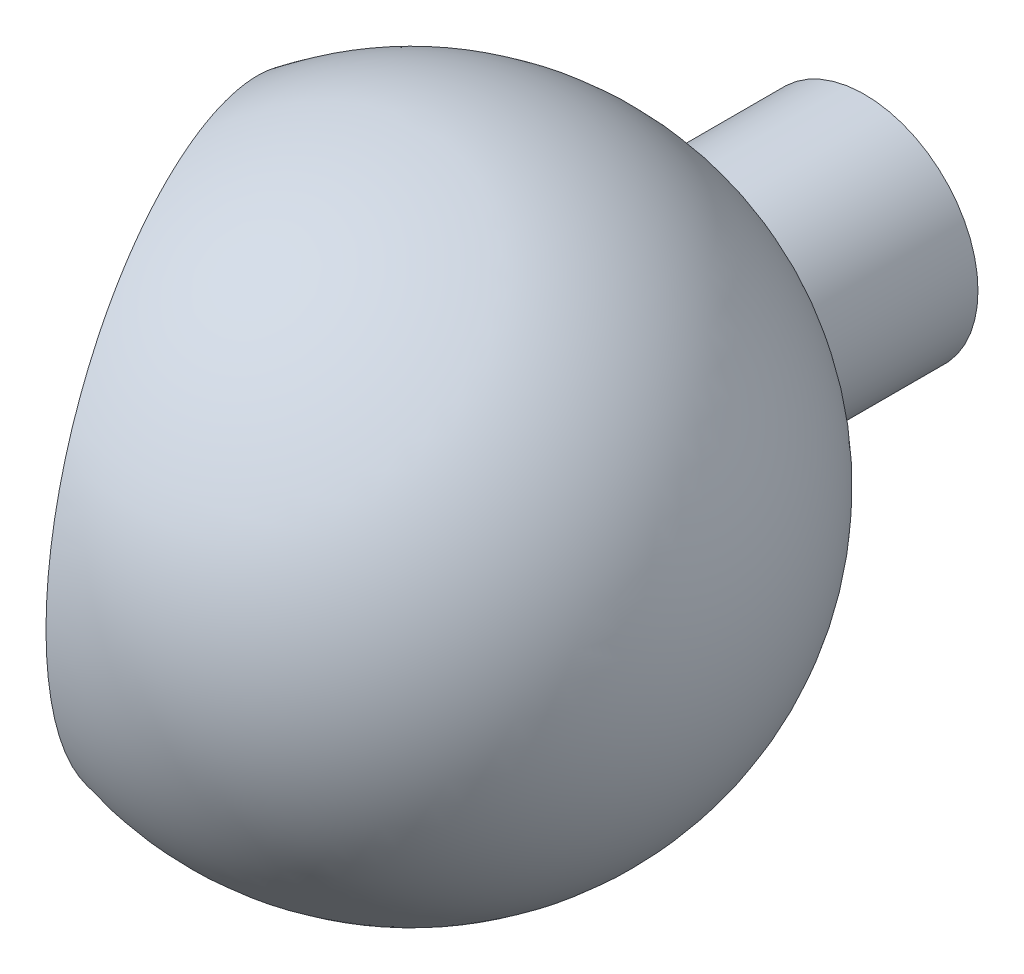
ISO-10303-21;
HEADER;
FILE_DESCRIPTION(('STEP AP214'),'2;1');
FILE_NAME('part.step','',(''),(''),'','','');
FILE_SCHEMA(('AUTOMOTIVE_DESIGN { 1 0 10303 214 1 1 1 1 }'));
ENDSEC;
DATA;
#1=APPLICATION_CONTEXT('core data for automotive mechanical design processes');
#2=APPLICATION_PROTOCOL_DEFINITION('international standard','automotive_design',2000,#1);
#3=PRODUCT_CONTEXT('',#1,'mechanical');
#4=PRODUCT('Part','Part','',(#3));
#5=PRODUCT_RELATED_PRODUCT_CATEGORY('part','',(#4));
#6=PRODUCT_DEFINITION_FORMATION('','',#4);
#7=PRODUCT_DEFINITION_CONTEXT('part definition',#1,'design');
#8=PRODUCT_DEFINITION('design','',#6,#7);
#9=PRODUCT_DEFINITION_SHAPE('','',#8);
#10=(LENGTH_UNIT() NAMED_UNIT(*) SI_UNIT(.MILLI.,.METRE.));
#11=(NAMED_UNIT(*) PLANE_ANGLE_UNIT() SI_UNIT($,.RADIAN.));
#12=(NAMED_UNIT(*) SI_UNIT($,.STERADIAN.) SOLID_ANGLE_UNIT());
#13=UNCERTAINTY_MEASURE_WITH_UNIT(LENGTH_MEASURE(1.E-05),#10,'distance_accuracy_value','');
#14=(GEOMETRIC_REPRESENTATION_CONTEXT(3) GLOBAL_UNCERTAINTY_ASSIGNED_CONTEXT((#13)) GLOBAL_UNIT_ASSIGNED_CONTEXT((#10,
#11,#12)) REPRESENTATION_CONTEXT('',''));
#15=CARTESIAN_POINT('',(0.,0.,0.));
#16=DIRECTION('',(0.,0.,1.));
#17=DIRECTION('',(1.,0.,0.));
#18=AXIS2_PLACEMENT_3D('',#15,#16,#17);
#19=CARTESIAN_POINT('',(0.,0.,8.));
#20=DIRECTION('',(0.,1.,0.));
#21=DIRECTION('',(-1.,0.,0.));
#22=AXIS2_PLACEMENT_3D('',#19,#20,#21);
#23=SPHERICAL_SURFACE('',#22,5.5);
#24=CARTESIAN_POINT('',(0.,0.,2.8765246170202));
#25=DIRECTION('',(0.,0.,1.));
#26=DIRECTION('',(1.,0.,0.));
#27=AXIS2_PLACEMENT_3D('',#24,#25,#26);
#28=CIRCLE('',#27,2.);
#29=CARTESIAN_POINT('',(2.,0.,2.8765246170202));
#30=VERTEX_POINT('',#29);
#31=EDGE_CURVE('E43',#30,#30,#28,.F.);
#32=ORIENTED_EDGE('',*,*,#31,.F.);
#33=EDGE_LOOP('',(#32));
#34=FACE_BOUND('',#33,.T.);
#35=CARTESIAN_POINT('',(-2.6578520975547,0.,8.9673790505919));
#36=DIRECTION('',(-0.939692620785908,0.,0.34202014332567));
#37=DIRECTION('',(0.34202014332567,0.,0.939692620785908));
#38=AXIS2_PLACEMENT_3D('',#35,#36,#37);
#39=CIRCLE('',#38,4.7169905660283);
#40=CARTESIAN_POINT('',(-1.04454630809587,0.,13.3999002778054));
#41=VERTEX_POINT('',#40);
#42=EDGE_CURVE('E10',#41,#41,#39,.F.);
#43=ORIENTED_EDGE('',*,*,#42,.T.);
#44=EDGE_LOOP('',(#43));
#45=FACE_BOUND('',#44,.T.);
#46=ADVANCED_FACE('F31',(#34,#45),#23,.T.);
#47=CARTESIAN_POINT('',(0.,0.,5.));
#48=DIRECTION('',(0.,0.,-1.));
#49=DIRECTION('',(-1.,0.,0.));
#50=AXIS2_PLACEMENT_3D('',#47,#48,#49);
#51=CYLINDRICAL_SURFACE('',#50,2.);
#52=ORIENTED_EDGE('',*,*,#31,.T.);
#53=EDGE_LOOP('',(#52));
#54=FACE_BOUND('',#53,.T.);
#55=CARTESIAN_POINT('',(0.,0.,0.));
#56=DIRECTION('',(0.,0.,1.));
#57=DIRECTION('',(1.,0.,0.));
#58=AXIS2_PLACEMENT_3D('',#55,#56,#57);
#59=CIRCLE('',#58,2.);
#60=CARTESIAN_POINT('',(2.,0.,0.));
#61=VERTEX_POINT('',#60);
#62=EDGE_CURVE('E39',#61,#61,#59,.T.);
#63=ORIENTED_EDGE('',*,*,#62,.T.);
#64=EDGE_LOOP('',(#63));
#65=FACE_BOUND('',#64,.T.);
#66=ADVANCED_FACE('F33',(#54,#65),#51,.T.);
#67=CARTESIAN_POINT('',(0.,0.,0.));
#68=DIRECTION('',(0.,0.,1.));
#69=DIRECTION('',(1.,0.,0.));
#70=AXIS2_PLACEMENT_3D('',#67,#68,#69);
#71=PLANE('',#70);
#72=ORIENTED_EDGE('',*,*,#62,.F.);
#73=EDGE_LOOP('',(#72));
#74=FACE_BOUND('',#73,.T.);
#75=ADVANCED_FACE('F61',(#74),#71,.F.);
#76=CARTESIAN_POINT('',(-3.85492259919454,10.,5.67845487784122));
#77=DIRECTION('',(-0.939692620785908,0.,0.34202014332567));
#78=DIRECTION('',(0.34202014332567,0.,0.939692620785908));
#79=AXIS2_PLACEMENT_3D('',#76,#77,#78);
#80=PLANE('',#79);
#81=CARTESIAN_POINT('',(-2.65785209755469,0.,8.96737905059192));
#82=DIRECTION('',(-0.939692620785908,0.,0.34202014332567));
#83=DIRECTION('',(0.34202014332567,0.,0.939692620785908));
#84=AXIS2_PLACEMENT_3D('',#81,#82,#83);
#85=CIRCLE('',#84,3.50000000000003);
#86=CARTESIAN_POINT('',(-1.46078159591484,0.,12.2563032233426));
#87=VERTEX_POINT('',#86);
#88=EDGE_CURVE('E35',#87,#87,#85,.F.);
#89=ORIENTED_EDGE('',*,*,#88,.T.);
#90=EDGE_LOOP('',(#89));
#91=FACE_BOUND('',#90,.T.);
#92=ORIENTED_EDGE('',*,*,#42,.F.);
#93=EDGE_LOOP('',(#92));
#94=FACE_BOUND('',#93,.T.);
#95=ADVANCED_FACE('F52',(#91,#94),#80,.T.);
#96=CARTESIAN_POINT('',(0.,0.,8.));
#97=DIRECTION('',(1.,0.,0.));
#98=DIRECTION('',(0.,1.,0.));
#99=AXIS2_PLACEMENT_3D('',#96,#97,#98);
#100=SPHERICAL_SURFACE('',#99,4.50000000000006);
#101=CARTESIAN_POINT('',(0.,0.,8.));
#102=DIRECTION('',(-0.939692620785908,0.,0.34202014332567));
#103=DIRECTION('',(0.34202014332567,0.,0.939692620785908));
#104=AXIS2_PLACEMENT_3D('',#101,#102,#103);
#105=SPHERICAL_SURFACE('',#104,4.50000000000006);
#106=ORIENTED_EDGE('',*,*,#88,.F.);
#107=EDGE_LOOP('',(#106));
#108=FACE_BOUND('',#107,.T.);
#109=ADVANCED_FACE('F55',(#108),#105,.F.);
#110=CLOSED_SHELL('',(#46,#66,#75,#95,#109));
#111=MANIFOLD_SOLID_BREP('B2',#110);
#112=ADVANCED_BREP_SHAPE_REPRESENTATION('',(#18,#111),#14);
#113=SHAPE_DEFINITION_REPRESENTATION(#9,#112);
ENDSEC;
END-ISO-10303-21;
